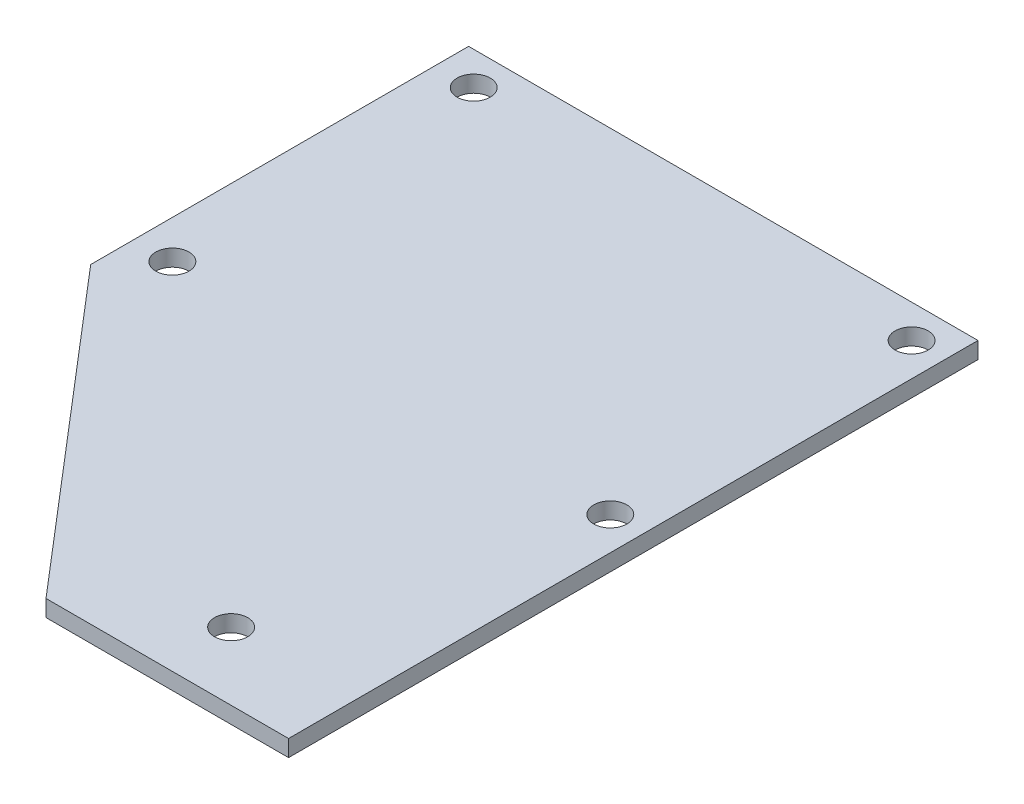
ISO-10303-21;
HEADER;
FILE_DESCRIPTION(('STEP AP214'),'2;1');
FILE_NAME('part.step','',(''),(''),'','','');
FILE_SCHEMA(('AUTOMOTIVE_DESIGN { 1 0 10303 214 1 1 1 1 }'));
ENDSEC;
DATA;
#1=APPLICATION_CONTEXT('core data for automotive mechanical design processes');
#2=APPLICATION_PROTOCOL_DEFINITION('international standard','automotive_design',2000,#1);
#3=PRODUCT_CONTEXT('',#1,'mechanical');
#4=PRODUCT('Part','Part','',(#3));
#5=PRODUCT_RELATED_PRODUCT_CATEGORY('part','',(#4));
#6=PRODUCT_DEFINITION_FORMATION('','',#4);
#7=PRODUCT_DEFINITION_CONTEXT('part definition',#1,'design');
#8=PRODUCT_DEFINITION('design','',#6,#7);
#9=PRODUCT_DEFINITION_SHAPE('','',#8);
#10=(LENGTH_UNIT() NAMED_UNIT(*) SI_UNIT(.MILLI.,.METRE.));
#11=(NAMED_UNIT(*) PLANE_ANGLE_UNIT() SI_UNIT($,.RADIAN.));
#12=(NAMED_UNIT(*) SI_UNIT($,.STERADIAN.) SOLID_ANGLE_UNIT());
#13=UNCERTAINTY_MEASURE_WITH_UNIT(LENGTH_MEASURE(1.E-05),#10,'distance_accuracy_value','');
#14=(GEOMETRIC_REPRESENTATION_CONTEXT(3) GLOBAL_UNCERTAINTY_ASSIGNED_CONTEXT((#13)) GLOBAL_UNIT_ASSIGNED_CONTEXT((#10,
#11,#12)) REPRESENTATION_CONTEXT('',''));
#15=CARTESIAN_POINT('',(0.,0.,0.));
#16=DIRECTION('',(0.,0.,1.));
#17=DIRECTION('',(1.,0.,0.));
#18=AXIS2_PLACEMENT_3D('',#15,#16,#17);
#19=CARTESIAN_POINT('',(0.,3.302,0.));
#20=DIRECTION('',(-1.,0.,0.));
#21=DIRECTION('',(0.,0.,1.));
#22=AXIS2_PLACEMENT_3D('',#19,#20,#21);
#23=PLANE('',#22);
#24=DIRECTION('',(0.,0.,-1.));
#25=VECTOR('',#24,1.);
#26=CARTESIAN_POINT('',(0.,0.,0.));
#27=LINE('',#26,#25);
#28=CARTESIAN_POINT('',(0.,0.,0.));
#29=VERTEX_POINT('',#28);
#30=CARTESIAN_POINT('',(0.,0.,-137.16));
#31=VERTEX_POINT('',#30);
#32=EDGE_CURVE('E120',#29,#31,#27,.T.);
#33=ORIENTED_EDGE('',*,*,#32,.T.);
#34=DIRECTION('',(0.,-1.,0.));
#35=VECTOR('',#34,1.);
#36=CARTESIAN_POINT('',(0.,3.302,-137.16));
#37=LINE('',#36,#35);
#38=CARTESIAN_POINT('',(0.,3.302,-137.16));
#39=VERTEX_POINT('',#38);
#40=EDGE_CURVE('E11',#39,#31,#37,.T.);
#41=ORIENTED_EDGE('',*,*,#40,.F.);
#42=DIRECTION('',(0.,0.,-1.));
#43=VECTOR('',#42,1.);
#44=CARTESIAN_POINT('',(0.,3.302,0.));
#45=LINE('',#44,#43);
#46=CARTESIAN_POINT('',(0.,3.302,0.));
#47=VERTEX_POINT('',#46);
#48=EDGE_CURVE('E133',#47,#39,#45,.T.);
#49=ORIENTED_EDGE('',*,*,#48,.F.);
#50=DIRECTION('',(0.,-1.,0.));
#51=VECTOR('',#50,1.);
#52=CARTESIAN_POINT('',(0.,3.302,0.));
#53=LINE('',#52,#51);
#54=EDGE_CURVE('E116',#47,#29,#53,.T.);
#55=ORIENTED_EDGE('',*,*,#54,.T.);
#56=EDGE_LOOP('',(#33,#41,#49,#55));
#57=FACE_BOUND('',#56,.T.);
#58=ADVANCED_FACE('F39',(#57),#23,.F.);
#59=CARTESIAN_POINT('',(0.,3.302,-137.16));
#60=DIRECTION('',(0.,0.,1.));
#61=DIRECTION('',(1.,0.,0.));
#62=AXIS2_PLACEMENT_3D('',#59,#60,#61);
#63=PLANE('',#62);
#64=DIRECTION('',(-1.,0.,0.));
#65=VECTOR('',#64,1.);
#66=CARTESIAN_POINT('',(0.,0.,-137.16));
#67=LINE('',#66,#65);
#68=CARTESIAN_POINT('',(-101.346,0.,-137.16));
#69=VERTEX_POINT('',#68);
#70=EDGE_CURVE('E124',#31,#69,#67,.T.);
#71=ORIENTED_EDGE('',*,*,#70,.T.);
#72=DIRECTION('',(0.,-1.,0.));
#73=VECTOR('',#72,1.);
#74=CARTESIAN_POINT('',(-101.346,3.302,-137.16));
#75=LINE('',#74,#73);
#76=CARTESIAN_POINT('',(-101.346,3.302,-137.16));
#77=VERTEX_POINT('',#76);
#78=EDGE_CURVE('E49',#77,#69,#75,.T.);
#79=ORIENTED_EDGE('',*,*,#78,.F.);
#80=DIRECTION('',(-1.,0.,0.));
#81=VECTOR('',#80,1.);
#82=CARTESIAN_POINT('',(0.,3.302,-137.16));
#83=LINE('',#82,#81);
#84=EDGE_CURVE('E92',#39,#77,#83,.T.);
#85=ORIENTED_EDGE('',*,*,#84,.F.);
#86=ORIENTED_EDGE('',*,*,#40,.T.);
#87=EDGE_LOOP('',(#71,#79,#85,#86));
#88=FACE_BOUND('',#87,.T.);
#89=ADVANCED_FACE('F177',(#88),#63,.F.);
#90=CARTESIAN_POINT('',(-101.346,3.302,-137.16));
#91=DIRECTION('',(1.,0.,0.));
#92=DIRECTION('',(0.,0.,-1.));
#93=AXIS2_PLACEMENT_3D('',#90,#91,#92);
#94=PLANE('',#93);
#95=DIRECTION('',(0.,0.,1.));
#96=VECTOR('',#95,1.);
#97=CARTESIAN_POINT('',(-101.346,0.,-137.16));
#98=LINE('',#97,#96);
#99=CARTESIAN_POINT('',(-101.346,0.,-61.976));
#100=VERTEX_POINT('',#99);
#101=EDGE_CURVE('E108',#69,#100,#98,.T.);
#102=ORIENTED_EDGE('',*,*,#101,.T.);
#103=DIRECTION('',(0.,-1.,0.));
#104=VECTOR('',#103,1.);
#105=CARTESIAN_POINT('',(-101.346,3.302,-61.976));
#106=LINE('',#105,#104);
#107=CARTESIAN_POINT('',(-101.346,3.302,-61.976));
#108=VERTEX_POINT('',#107);
#109=EDGE_CURVE('E105',#108,#100,#106,.T.);
#110=ORIENTED_EDGE('',*,*,#109,.F.);
#111=DIRECTION('',(0.,0.,1.));
#112=VECTOR('',#111,1.);
#113=CARTESIAN_POINT('',(-101.346,3.302,-137.16));
#114=LINE('',#113,#112);
#115=EDGE_CURVE('E96',#77,#108,#114,.T.);
#116=ORIENTED_EDGE('',*,*,#115,.F.);
#117=ORIENTED_EDGE('',*,*,#78,.T.);
#118=EDGE_LOOP('',(#102,#110,#116,#117));
#119=FACE_BOUND('',#118,.T.);
#120=ADVANCED_FACE('F106',(#119),#94,.F.);
#121=CARTESIAN_POINT('',(-48.26,3.302,0.));
#122=DIRECTION('',(0.759476272578049,0.,-0.650535003970542));
#123=DIRECTION('',(-0.650535003970542,0.,-0.759476272578049));
#124=AXIS2_PLACEMENT_3D('',#121,#122,#123);
#125=PLANE('',#124);
#126=DIRECTION('',(0.650535003970542,0.,0.759476272578049));
#127=VECTOR('',#126,1.);
#128=CARTESIAN_POINT('',(-48.26,0.,0.));
#129=LINE('',#128,#127);
#130=CARTESIAN_POINT('',(-48.26,0.,0.));
#131=VERTEX_POINT('',#130);
#132=EDGE_CURVE('E78',#100,#131,#129,.T.);
#133=ORIENTED_EDGE('',*,*,#132,.T.);
#134=DIRECTION('',(0.,-1.,0.));
#135=VECTOR('',#134,1.);
#136=CARTESIAN_POINT('',(-48.26,3.302,0.));
#137=LINE('',#136,#135);
#138=CARTESIAN_POINT('',(-48.26,3.302,0.));
#139=VERTEX_POINT('',#138);
#140=EDGE_CURVE('E110',#139,#131,#137,.T.);
#141=ORIENTED_EDGE('',*,*,#140,.F.);
#142=DIRECTION('',(0.650535003970542,0.,0.759476272578049));
#143=VECTOR('',#142,1.);
#144=CARTESIAN_POINT('',(-48.26,3.302,0.));
#145=LINE('',#144,#143);
#146=EDGE_CURVE('E100',#108,#139,#145,.T.);
#147=ORIENTED_EDGE('',*,*,#146,.F.);
#148=ORIENTED_EDGE('',*,*,#109,.T.);
#149=EDGE_LOOP('',(#133,#141,#147,#148));
#150=FACE_BOUND('',#149,.T.);
#151=ADVANCED_FACE('F112',(#150),#125,.F.);
#152=CARTESIAN_POINT('',(0.,3.302,0.));
#153=DIRECTION('',(0.,0.,-1.));
#154=DIRECTION('',(-1.,0.,0.));
#155=AXIS2_PLACEMENT_3D('',#152,#153,#154);
#156=PLANE('',#155);
#157=DIRECTION('',(1.,0.,0.));
#158=VECTOR('',#157,1.);
#159=CARTESIAN_POINT('',(0.,0.,0.));
#160=LINE('',#159,#158);
#161=EDGE_CURVE('E84',#131,#29,#160,.T.);
#162=ORIENTED_EDGE('',*,*,#161,.T.);
#163=ORIENTED_EDGE('',*,*,#54,.F.);
#164=DIRECTION('',(1.,0.,0.));
#165=VECTOR('',#164,1.);
#166=CARTESIAN_POINT('',(0.,3.302,0.));
#167=LINE('',#166,#165);
#168=EDGE_CURVE('E58',#139,#47,#167,.T.);
#169=ORIENTED_EDGE('',*,*,#168,.F.);
#170=ORIENTED_EDGE('',*,*,#140,.T.);
#171=EDGE_LOOP('',(#162,#163,#169,#170));
#172=FACE_BOUND('',#171,.T.);
#173=ADVANCED_FACE('F195',(#172),#156,.F.);
#174=CARTESIAN_POINT('',(0.,3.302,0.));
#175=DIRECTION('',(0.,1.,0.));
#176=DIRECTION('',(0.,0.,1.));
#177=AXIS2_PLACEMENT_3D('',#174,#175,#176);
#178=PLANE('',#177);
#179=CARTESIAN_POINT('',(-93.726,3.302,-130.556));
#180=DIRECTION('',(0.,1.,0.));
#181=DIRECTION('',(0.,0.,1.));
#182=AXIS2_PLACEMENT_3D('',#179,#180,#181);
#183=CIRCLE('',#182,3.302);
#184=CARTESIAN_POINT('',(-93.726,3.302,-127.254));
#185=VERTEX_POINT('',#184);
#186=EDGE_CURVE('E284',#185,#185,#183,.T.);
#187=ORIENTED_EDGE('',*,*,#186,.F.);
#188=EDGE_LOOP('',(#187));
#189=FACE_BOUND('',#188,.T.);
#190=CARTESIAN_POINT('',(-6.604,3.302,-130.556));
#191=DIRECTION('',(0.,1.,0.));
#192=DIRECTION('',(0.,0.,1.));
#193=AXIS2_PLACEMENT_3D('',#190,#191,#192);
#194=CIRCLE('',#193,3.302);
#195=CARTESIAN_POINT('',(-6.604,3.302,-127.254));
#196=VERTEX_POINT('',#195);
#197=EDGE_CURVE('E277',#196,#196,#194,.T.);
#198=ORIENTED_EDGE('',*,*,#197,.F.);
#199=EDGE_LOOP('',(#198));
#200=FACE_BOUND('',#199,.T.);
#201=CARTESIAN_POINT('',(-6.604,3.302,-70.612));
#202=DIRECTION('',(0.,1.,0.));
#203=DIRECTION('',(0.,0.,1.));
#204=AXIS2_PLACEMENT_3D('',#201,#202,#203);
#205=CIRCLE('',#204,3.302);
#206=CARTESIAN_POINT('',(-6.604,3.302,-67.31));
#207=VERTEX_POINT('',#206);
#208=EDGE_CURVE('E265',#207,#207,#205,.T.);
#209=ORIENTED_EDGE('',*,*,#208,.F.);
#210=EDGE_LOOP('',(#209));
#211=FACE_BOUND('',#210,.T.);
#212=CARTESIAN_POINT('',(-24.892,3.302,-13.462));
#213=DIRECTION('',(0.,1.,0.));
#214=DIRECTION('',(0.,0.,1.));
#215=AXIS2_PLACEMENT_3D('',#212,#213,#214);
#216=CIRCLE('',#215,3.302);
#217=CARTESIAN_POINT('',(-24.892,3.302,-10.16));
#218=VERTEX_POINT('',#217);
#219=EDGE_CURVE('E276',#218,#218,#216,.T.);
#220=ORIENTED_EDGE('',*,*,#219,.F.);
#221=EDGE_LOOP('',(#220));
#222=FACE_BOUND('',#221,.T.);
#223=CARTESIAN_POINT('',(-93.726,3.302,-70.612));
#224=DIRECTION('',(0.,1.,0.));
#225=DIRECTION('',(0.,0.,1.));
#226=AXIS2_PLACEMENT_3D('',#223,#224,#225);
#227=CIRCLE('',#226,3.302);
#228=CARTESIAN_POINT('',(-93.726,3.302,-67.31));
#229=VERTEX_POINT('',#228);
#230=EDGE_CURVE('E145',#229,#229,#227,.T.);
#231=ORIENTED_EDGE('',*,*,#230,.F.);
#232=EDGE_LOOP('',(#231));
#233=FACE_BOUND('',#232,.T.);
#234=ORIENTED_EDGE('',*,*,#48,.T.);
#235=ORIENTED_EDGE('',*,*,#84,.T.);
#236=ORIENTED_EDGE('',*,*,#115,.T.);
#237=ORIENTED_EDGE('',*,*,#146,.T.);
#238=ORIENTED_EDGE('',*,*,#168,.T.);
#239=EDGE_LOOP('',(#234,#235,#236,#237,#238));
#240=FACE_BOUND('',#239,.T.);
#241=ADVANCED_FACE('F98',(#189,#200,#211,#222,#233,#240),#178,.T.);
#242=CARTESIAN_POINT('',(0.,0.,0.));
#243=DIRECTION('',(0.,1.,0.));
#244=DIRECTION('',(0.,0.,1.));
#245=AXIS2_PLACEMENT_3D('',#242,#243,#244);
#246=PLANE('',#245);
#247=CARTESIAN_POINT('',(-93.726,0.,-130.556));
#248=DIRECTION('',(0.,1.,0.));
#249=DIRECTION('',(0.,0.,1.));
#250=AXIS2_PLACEMENT_3D('',#247,#248,#249);
#251=CIRCLE('',#250,3.302);
#252=CARTESIAN_POINT('',(-93.726,0.,-127.254));
#253=VERTEX_POINT('',#252);
#254=EDGE_CURVE('E42',#253,#253,#251,.T.);
#255=ORIENTED_EDGE('',*,*,#254,.T.);
#256=EDGE_LOOP('',(#255));
#257=FACE_BOUND('',#256,.T.);
#258=CARTESIAN_POINT('',(-6.604,0.,-130.556));
#259=DIRECTION('',(0.,1.,0.));
#260=DIRECTION('',(0.,0.,1.));
#261=AXIS2_PLACEMENT_3D('',#258,#259,#260);
#262=CIRCLE('',#261,3.302);
#263=CARTESIAN_POINT('',(-6.604,0.,-127.254));
#264=VERTEX_POINT('',#263);
#265=EDGE_CURVE('E152',#264,#264,#262,.T.);
#266=ORIENTED_EDGE('',*,*,#265,.T.);
#267=EDGE_LOOP('',(#266));
#268=FACE_BOUND('',#267,.T.);
#269=CARTESIAN_POINT('',(-6.604,0.,-70.612));
#270=DIRECTION('',(0.,1.,0.));
#271=DIRECTION('',(0.,0.,1.));
#272=AXIS2_PLACEMENT_3D('',#269,#270,#271);
#273=CIRCLE('',#272,3.302);
#274=CARTESIAN_POINT('',(-6.604,0.,-67.31));
#275=VERTEX_POINT('',#274);
#276=EDGE_CURVE('E149',#275,#275,#273,.T.);
#277=ORIENTED_EDGE('',*,*,#276,.T.);
#278=EDGE_LOOP('',(#277));
#279=FACE_BOUND('',#278,.T.);
#280=CARTESIAN_POINT('',(-24.892,0.,-13.462));
#281=DIRECTION('',(0.,1.,0.));
#282=DIRECTION('',(0.,0.,1.));
#283=AXIS2_PLACEMENT_3D('',#280,#281,#282);
#284=CIRCLE('',#283,3.302);
#285=CARTESIAN_POINT('',(-24.892,0.,-10.16));
#286=VERTEX_POINT('',#285);
#287=EDGE_CURVE('E144',#286,#286,#284,.T.);
#288=ORIENTED_EDGE('',*,*,#287,.T.);
#289=EDGE_LOOP('',(#288));
#290=FACE_BOUND('',#289,.T.);
#291=CARTESIAN_POINT('',(-93.726,0.,-70.612));
#292=DIRECTION('',(0.,1.,0.));
#293=DIRECTION('',(0.,0.,1.));
#294=AXIS2_PLACEMENT_3D('',#291,#292,#293);
#295=CIRCLE('',#294,3.302);
#296=CARTESIAN_POINT('',(-93.726,0.,-67.31));
#297=VERTEX_POINT('',#296);
#298=EDGE_CURVE('E140',#297,#297,#295,.T.);
#299=ORIENTED_EDGE('',*,*,#298,.T.);
#300=EDGE_LOOP('',(#299));
#301=FACE_BOUND('',#300,.T.);
#302=ORIENTED_EDGE('',*,*,#32,.F.);
#303=ORIENTED_EDGE('',*,*,#161,.F.);
#304=ORIENTED_EDGE('',*,*,#132,.F.);
#305=ORIENTED_EDGE('',*,*,#101,.F.);
#306=ORIENTED_EDGE('',*,*,#70,.F.);
#307=EDGE_LOOP('',(#302,#303,#304,#305,#306));
#308=FACE_BOUND('',#307,.T.);
#309=ADVANCED_FACE('F161',(#257,#268,#279,#290,#301,#308),#246,.F.);
#310=CARTESIAN_POINT('',(-93.726,-20.066,-70.612));
#311=DIRECTION('',(0.,1.,0.));
#312=DIRECTION('',(0.,0.,1.));
#313=AXIS2_PLACEMENT_3D('',#310,#311,#312);
#314=CYLINDRICAL_SURFACE('',#313,3.302);
#315=CARTESIAN_POINT('',(-93.726,3.302,-67.31));
#316=CARTESIAN_POINT('',(-93.726,3.26760416666667,-67.31));
#317=CARTESIAN_POINT('',(-93.726,3.23320833333334,-67.31));
#318=CARTESIAN_POINT('',(-93.726,3.16441666666667,-67.31));
#319=CARTESIAN_POINT('',(-93.726,3.13002083333333,-67.31));
#320=CARTESIAN_POINT('',(-93.726,3.06122916666667,-67.31));
#321=CARTESIAN_POINT('',(-93.726,3.02683333333334,-67.31));
#322=CARTESIAN_POINT('',(-93.726,2.95804166666667,-67.31));
#323=CARTESIAN_POINT('',(-93.726,2.92364583333334,-67.31));
#324=CARTESIAN_POINT('',(-93.726,2.85485416666667,-67.31));
#325=CARTESIAN_POINT('',(-93.726,2.82045833333334,-67.31));
#326=CARTESIAN_POINT('',(-93.726,2.75166666666667,-67.31));
#327=CARTESIAN_POINT('',(-93.726,2.71727083333333,-67.31));
#328=CARTESIAN_POINT('',(-93.726,2.64847916666667,-67.31));
#329=CARTESIAN_POINT('',(-93.726,2.61408333333333,-67.31));
#330=CARTESIAN_POINT('',(-93.726,2.54529166666667,-67.31));
#331=CARTESIAN_POINT('',(-93.726,2.51089583333334,-67.31));
#332=CARTESIAN_POINT('',(-93.726,2.44210416666667,-67.31));
#333=CARTESIAN_POINT('',(-93.726,2.40770833333334,-67.31));
#334=CARTESIAN_POINT('',(-93.726,2.33891666666667,-67.31));
#335=CARTESIAN_POINT('',(-93.726,2.30452083333333,-67.31));
#336=CARTESIAN_POINT('',(-93.726,2.23572916666667,-67.31));
#337=CARTESIAN_POINT('',(-93.726,2.20133333333333,-67.31));
#338=CARTESIAN_POINT('',(-93.726,2.13254166666667,-67.31));
#339=CARTESIAN_POINT('',(-93.726,2.09814583333333,-67.31));
#340=CARTESIAN_POINT('',(-93.726,2.02935416666667,-67.31));
#341=CARTESIAN_POINT('',(-93.726,1.99495833333333,-67.31));
#342=CARTESIAN_POINT('',(-93.726,1.92616666666667,-67.31));
#343=CARTESIAN_POINT('',(-93.726,1.89177083333333,-67.31));
#344=CARTESIAN_POINT('',(-93.726,1.82297916666667,-67.31));
#345=CARTESIAN_POINT('',(-93.726,1.78858333333333,-67.31));
#346=CARTESIAN_POINT('',(-93.726,1.71979166666667,-67.31));
#347=CARTESIAN_POINT('',(-93.726,1.68539583333333,-67.31));
#348=CARTESIAN_POINT('',(-93.726,1.61660416666667,-67.31));
#349=CARTESIAN_POINT('',(-93.726,1.58220833333333,-67.31));
#350=CARTESIAN_POINT('',(-93.726,1.51341666666667,-67.31));
#351=CARTESIAN_POINT('',(-93.726,1.47902083333333,-67.31));
#352=CARTESIAN_POINT('',(-93.726,1.41022916666666,-67.31));
#353=CARTESIAN_POINT('',(-93.726,1.37583333333333,-67.31));
#354=CARTESIAN_POINT('',(-93.726,1.30704166666666,-67.31));
#355=CARTESIAN_POINT('',(-93.726,1.27264583333333,-67.31));
#356=CARTESIAN_POINT('',(-93.726,1.20385416666667,-67.31));
#357=CARTESIAN_POINT('',(-93.726,1.16945833333333,-67.31));
#358=CARTESIAN_POINT('',(-93.726,1.10066666666667,-67.31));
#359=CARTESIAN_POINT('',(-93.726,1.06627083333333,-67.31));
#360=CARTESIAN_POINT('',(-93.726,0.997479166666664,-67.31));
#361=CARTESIAN_POINT('',(-93.726,0.963083333333331,-67.31));
#362=CARTESIAN_POINT('',(-93.726,0.894291666666664,-67.31));
#363=CARTESIAN_POINT('',(-93.726,0.85989583333333,-67.31));
#364=CARTESIAN_POINT('',(-93.726,0.791104166666664,-67.31));
#365=CARTESIAN_POINT('',(-93.726,0.756708333333331,-67.31));
#366=CARTESIAN_POINT('',(-93.726,0.687916666666665,-67.31));
#367=CARTESIAN_POINT('',(-93.726,0.653520833333332,-67.31));
#368=CARTESIAN_POINT('',(-93.726,0.584729166666665,-67.31));
#369=CARTESIAN_POINT('',(-93.726,0.550333333333331,-67.31));
#370=CARTESIAN_POINT('',(-93.726,0.481541666666664,-67.31));
#371=CARTESIAN_POINT('',(-93.726,0.44714583333333,-67.31));
#372=CARTESIAN_POINT('',(-93.726,0.378354166666663,-67.31));
#373=CARTESIAN_POINT('',(-93.726,0.343958333333329,-67.31));
#374=CARTESIAN_POINT('',(-93.726,0.275166666666663,-67.31));
#375=CARTESIAN_POINT('',(-93.726,0.240770833333331,-67.31));
#376=CARTESIAN_POINT('',(-93.726,0.171979166666665,-67.31));
#377=CARTESIAN_POINT('',(-93.726,0.137583333333331,-67.31));
#378=CARTESIAN_POINT('',(-93.726,0.0687916666666638,-67.31));
#379=CARTESIAN_POINT('',(-93.726,0.0343958333333301,-67.31));
#380=CARTESIAN_POINT('',(-93.726,0.,-67.31));
#381=B_SPLINE_CURVE_WITH_KNOTS('',3,(#315,#316,#317,#318,#319,#320,#321,#322,#323,#324,#325,
#326,#327,#328,#329,#330,#331,#332,#333,#334,#335,#336,#337,#338,#339,#340,#341,#342,#343,#344,
#345,#346,#347,#348,#349,#350,#351,#352,#353,#354,#355,#356,#357,#358,#359,#360,#361,#362,#363,
#364,#365,#366,#367,#368,#369,#370,#371,#372,#373,#374,#375,#376,#377,#378,#379,#380),
.UNSPECIFIED.,.F.,.F.,(4,2,2,2,2,2,2,2,2,2,2,2,2,2,2,2,2,2,2,2,2,2,2,2,2,2,2,2,2,2,2,2,4),(0.,
0.103187500000001,0.206375000000002,0.309562499999999,0.41275,0.515937500000001,
0.619125000000002,0.722312500000002,0.8255,0.928687500000001,1.031875,1.1350625,1.23825,
1.3414375,1.444625,1.5478125,1.651,1.7541875,1.857375,1.96056250000001,2.06375,2.1669375,
2.270125,2.37331250000001,2.47650000000001,2.5796875,2.682875,2.78606250000001,2.88925000000001,
2.99243750000001,3.095625,3.19881250000001,3.30200000000001),.UNSPECIFIED.);
#382=EDGE_CURVE('BSEAM187',#229,#297,#381,.T.);
#383=ORIENTED_EDGE('',*,*,#230,.T.);
#384=ORIENTED_EDGE('',*,*,#298,.F.);
#385=ORIENTED_EDGE('',*,*,#382,.T.);
#386=ORIENTED_EDGE('',*,*,#382,.F.);
#387=EDGE_LOOP('',(#383,#385,#384,#386));
#388=FACE_BOUND('',#387,.T.);
#389=ADVANCED_FACE('F187',(#388),#314,.F.);
#390=CARTESIAN_POINT('',(-24.892,-20.066,-13.462));
#391=DIRECTION('',(0.,1.,0.));
#392=DIRECTION('',(0.,0.,1.));
#393=AXIS2_PLACEMENT_3D('',#390,#391,#392);
#394=CYLINDRICAL_SURFACE('',#393,3.302);
#395=CARTESIAN_POINT('',(-24.892,3.302,-10.16));
#396=CARTESIAN_POINT('',(-24.892,3.26760416666667,-10.16));
#397=CARTESIAN_POINT('',(-24.892,3.23320833333334,-10.16));
#398=CARTESIAN_POINT('',(-24.892,3.16441666666667,-10.16));
#399=CARTESIAN_POINT('',(-24.892,3.13002083333333,-10.16));
#400=CARTESIAN_POINT('',(-24.892,3.06122916666667,-10.16));
#401=CARTESIAN_POINT('',(-24.892,3.02683333333334,-10.16));
#402=CARTESIAN_POINT('',(-24.892,2.95804166666667,-10.16));
#403=CARTESIAN_POINT('',(-24.892,2.92364583333334,-10.16));
#404=CARTESIAN_POINT('',(-24.892,2.85485416666667,-10.16));
#405=CARTESIAN_POINT('',(-24.892,2.82045833333334,-10.16));
#406=CARTESIAN_POINT('',(-24.892,2.75166666666667,-10.16));
#407=CARTESIAN_POINT('',(-24.892,2.71727083333333,-10.16));
#408=CARTESIAN_POINT('',(-24.892,2.64847916666667,-10.16));
#409=CARTESIAN_POINT('',(-24.892,2.61408333333333,-10.16));
#410=CARTESIAN_POINT('',(-24.892,2.54529166666667,-10.16));
#411=CARTESIAN_POINT('',(-24.892,2.51089583333334,-10.16));
#412=CARTESIAN_POINT('',(-24.892,2.44210416666667,-10.16));
#413=CARTESIAN_POINT('',(-24.892,2.40770833333334,-10.16));
#414=CARTESIAN_POINT('',(-24.892,2.33891666666667,-10.16));
#415=CARTESIAN_POINT('',(-24.892,2.30452083333333,-10.16));
#416=CARTESIAN_POINT('',(-24.892,2.23572916666667,-10.16));
#417=CARTESIAN_POINT('',(-24.892,2.20133333333333,-10.16));
#418=CARTESIAN_POINT('',(-24.892,2.13254166666667,-10.16));
#419=CARTESIAN_POINT('',(-24.892,2.09814583333333,-10.16));
#420=CARTESIAN_POINT('',(-24.892,2.02935416666667,-10.16));
#421=CARTESIAN_POINT('',(-24.892,1.99495833333333,-10.16));
#422=CARTESIAN_POINT('',(-24.892,1.92616666666667,-10.16));
#423=CARTESIAN_POINT('',(-24.892,1.89177083333333,-10.16));
#424=CARTESIAN_POINT('',(-24.892,1.82297916666667,-10.16));
#425=CARTESIAN_POINT('',(-24.892,1.78858333333333,-10.16));
#426=CARTESIAN_POINT('',(-24.892,1.71979166666667,-10.16));
#427=CARTESIAN_POINT('',(-24.892,1.68539583333333,-10.16));
#428=CARTESIAN_POINT('',(-24.892,1.61660416666667,-10.16));
#429=CARTESIAN_POINT('',(-24.892,1.58220833333333,-10.16));
#430=CARTESIAN_POINT('',(-24.892,1.51341666666667,-10.16));
#431=CARTESIAN_POINT('',(-24.892,1.47902083333333,-10.16));
#432=CARTESIAN_POINT('',(-24.892,1.41022916666666,-10.16));
#433=CARTESIAN_POINT('',(-24.892,1.37583333333333,-10.16));
#434=CARTESIAN_POINT('',(-24.892,1.30704166666666,-10.16));
#435=CARTESIAN_POINT('',(-24.892,1.27264583333333,-10.16));
#436=CARTESIAN_POINT('',(-24.892,1.20385416666667,-10.16));
#437=CARTESIAN_POINT('',(-24.892,1.16945833333333,-10.16));
#438=CARTESIAN_POINT('',(-24.892,1.10066666666667,-10.16));
#439=CARTESIAN_POINT('',(-24.892,1.06627083333333,-10.16));
#440=CARTESIAN_POINT('',(-24.892,0.997479166666664,-10.16));
#441=CARTESIAN_POINT('',(-24.892,0.963083333333331,-10.16));
#442=CARTESIAN_POINT('',(-24.892,0.894291666666664,-10.16));
#443=CARTESIAN_POINT('',(-24.892,0.85989583333333,-10.16));
#444=CARTESIAN_POINT('',(-24.892,0.791104166666664,-10.16));
#445=CARTESIAN_POINT('',(-24.892,0.756708333333331,-10.16));
#446=CARTESIAN_POINT('',(-24.892,0.687916666666665,-10.16));
#447=CARTESIAN_POINT('',(-24.892,0.653520833333332,-10.16));
#448=CARTESIAN_POINT('',(-24.892,0.584729166666665,-10.16));
#449=CARTESIAN_POINT('',(-24.892,0.550333333333331,-10.16));
#450=CARTESIAN_POINT('',(-24.892,0.481541666666664,-10.16));
#451=CARTESIAN_POINT('',(-24.892,0.44714583333333,-10.16));
#452=CARTESIAN_POINT('',(-24.892,0.378354166666663,-10.16));
#453=CARTESIAN_POINT('',(-24.892,0.343958333333329,-10.16));
#454=CARTESIAN_POINT('',(-24.892,0.275166666666663,-10.16));
#455=CARTESIAN_POINT('',(-24.892,0.240770833333331,-10.16));
#456=CARTESIAN_POINT('',(-24.892,0.171979166666665,-10.16));
#457=CARTESIAN_POINT('',(-24.892,0.137583333333331,-10.16));
#458=CARTESIAN_POINT('',(-24.892,0.0687916666666638,-10.16));
#459=CARTESIAN_POINT('',(-24.892,0.0343958333333301,-10.16));
#460=CARTESIAN_POINT('',(-24.892,0.,-10.16));
#461=B_SPLINE_CURVE_WITH_KNOTS('',3,(#395,#396,#397,#398,#399,#400,#401,#402,#403,#404,#405,
#406,#407,#408,#409,#410,#411,#412,#413,#414,#415,#416,#417,#418,#419,#420,#421,#422,#423,#424,
#425,#426,#427,#428,#429,#430,#431,#432,#433,#434,#435,#436,#437,#438,#439,#440,#441,#442,#443,
#444,#445,#446,#447,#448,#449,#450,#451,#452,#453,#454,#455,#456,#457,#458,#459,#460),
.UNSPECIFIED.,.F.,.F.,(4,2,2,2,2,2,2,2,2,2,2,2,2,2,2,2,2,2,2,2,2,2,2,2,2,2,2,2,2,2,2,2,4),(0.,
0.103187500000001,0.206375000000002,0.309562499999999,0.41275,0.515937500000001,
0.619125000000002,0.722312500000002,0.8255,0.928687500000001,1.031875,1.1350625,1.23825,
1.3414375,1.444625,1.5478125,1.651,1.7541875,1.857375,1.96056250000001,2.06375,2.1669375,
2.270125,2.37331250000001,2.47650000000001,2.5796875,2.682875,2.78606250000001,2.88925000000001,
2.99243750000001,3.095625,3.19881250000001,3.30200000000001),.UNSPECIFIED.);
#462=EDGE_CURVE('BSEAM193',#218,#286,#461,.T.);
#463=ORIENTED_EDGE('',*,*,#219,.T.);
#464=ORIENTED_EDGE('',*,*,#287,.F.);
#465=ORIENTED_EDGE('',*,*,#462,.T.);
#466=ORIENTED_EDGE('',*,*,#462,.F.);
#467=EDGE_LOOP('',(#463,#465,#464,#466));
#468=FACE_BOUND('',#467,.T.);
#469=ADVANCED_FACE('F193',(#468),#394,.F.);
#470=CARTESIAN_POINT('',(-6.604,-20.066,-70.612));
#471=DIRECTION('',(0.,1.,0.));
#472=DIRECTION('',(0.,0.,1.));
#473=AXIS2_PLACEMENT_3D('',#470,#471,#472);
#474=CYLINDRICAL_SURFACE('',#473,3.302);
#475=CARTESIAN_POINT('',(-6.604,3.302,-67.31));
#476=CARTESIAN_POINT('',(-6.604,3.26760416666667,-67.31));
#477=CARTESIAN_POINT('',(-6.604,3.23320833333334,-67.31));
#478=CARTESIAN_POINT('',(-6.604,3.16441666666667,-67.31));
#479=CARTESIAN_POINT('',(-6.604,3.13002083333333,-67.31));
#480=CARTESIAN_POINT('',(-6.604,3.06122916666667,-67.31));
#481=CARTESIAN_POINT('',(-6.604,3.02683333333334,-67.31));
#482=CARTESIAN_POINT('',(-6.604,2.95804166666667,-67.31));
#483=CARTESIAN_POINT('',(-6.604,2.92364583333334,-67.31));
#484=CARTESIAN_POINT('',(-6.604,2.85485416666667,-67.31));
#485=CARTESIAN_POINT('',(-6.604,2.82045833333334,-67.31));
#486=CARTESIAN_POINT('',(-6.604,2.75166666666667,-67.31));
#487=CARTESIAN_POINT('',(-6.604,2.71727083333333,-67.31));
#488=CARTESIAN_POINT('',(-6.604,2.64847916666667,-67.31));
#489=CARTESIAN_POINT('',(-6.604,2.61408333333333,-67.31));
#490=CARTESIAN_POINT('',(-6.604,2.54529166666667,-67.31));
#491=CARTESIAN_POINT('',(-6.604,2.51089583333334,-67.31));
#492=CARTESIAN_POINT('',(-6.604,2.44210416666667,-67.31));
#493=CARTESIAN_POINT('',(-6.604,2.40770833333334,-67.31));
#494=CARTESIAN_POINT('',(-6.604,2.33891666666667,-67.31));
#495=CARTESIAN_POINT('',(-6.604,2.30452083333333,-67.31));
#496=CARTESIAN_POINT('',(-6.604,2.23572916666667,-67.31));
#497=CARTESIAN_POINT('',(-6.604,2.20133333333333,-67.31));
#498=CARTESIAN_POINT('',(-6.604,2.13254166666667,-67.31));
#499=CARTESIAN_POINT('',(-6.604,2.09814583333333,-67.31));
#500=CARTESIAN_POINT('',(-6.604,2.02935416666667,-67.31));
#501=CARTESIAN_POINT('',(-6.604,1.99495833333333,-67.31));
#502=CARTESIAN_POINT('',(-6.604,1.92616666666667,-67.31));
#503=CARTESIAN_POINT('',(-6.604,1.89177083333333,-67.31));
#504=CARTESIAN_POINT('',(-6.604,1.82297916666667,-67.31));
#505=CARTESIAN_POINT('',(-6.604,1.78858333333333,-67.31));
#506=CARTESIAN_POINT('',(-6.604,1.71979166666667,-67.31));
#507=CARTESIAN_POINT('',(-6.604,1.68539583333333,-67.31));
#508=CARTESIAN_POINT('',(-6.604,1.61660416666667,-67.31));
#509=CARTESIAN_POINT('',(-6.604,1.58220833333333,-67.31));
#510=CARTESIAN_POINT('',(-6.604,1.51341666666667,-67.31));
#511=CARTESIAN_POINT('',(-6.604,1.47902083333333,-67.31));
#512=CARTESIAN_POINT('',(-6.604,1.41022916666666,-67.31));
#513=CARTESIAN_POINT('',(-6.604,1.37583333333333,-67.31));
#514=CARTESIAN_POINT('',(-6.604,1.30704166666666,-67.31));
#515=CARTESIAN_POINT('',(-6.604,1.27264583333333,-67.31));
#516=CARTESIAN_POINT('',(-6.604,1.20385416666667,-67.31));
#517=CARTESIAN_POINT('',(-6.604,1.16945833333333,-67.31));
#518=CARTESIAN_POINT('',(-6.604,1.10066666666667,-67.31));
#519=CARTESIAN_POINT('',(-6.604,1.06627083333333,-67.31));
#520=CARTESIAN_POINT('',(-6.604,0.997479166666664,-67.31));
#521=CARTESIAN_POINT('',(-6.604,0.963083333333331,-67.31));
#522=CARTESIAN_POINT('',(-6.604,0.894291666666664,-67.31));
#523=CARTESIAN_POINT('',(-6.604,0.85989583333333,-67.31));
#524=CARTESIAN_POINT('',(-6.604,0.791104166666664,-67.31));
#525=CARTESIAN_POINT('',(-6.604,0.756708333333331,-67.31));
#526=CARTESIAN_POINT('',(-6.604,0.687916666666665,-67.31));
#527=CARTESIAN_POINT('',(-6.604,0.653520833333332,-67.31));
#528=CARTESIAN_POINT('',(-6.604,0.584729166666665,-67.31));
#529=CARTESIAN_POINT('',(-6.604,0.550333333333331,-67.31));
#530=CARTESIAN_POINT('',(-6.604,0.481541666666664,-67.31));
#531=CARTESIAN_POINT('',(-6.604,0.44714583333333,-67.31));
#532=CARTESIAN_POINT('',(-6.604,0.378354166666663,-67.31));
#533=CARTESIAN_POINT('',(-6.604,0.343958333333329,-67.31));
#534=CARTESIAN_POINT('',(-6.604,0.275166666666663,-67.31));
#535=CARTESIAN_POINT('',(-6.604,0.240770833333331,-67.31));
#536=CARTESIAN_POINT('',(-6.604,0.171979166666665,-67.31));
#537=CARTESIAN_POINT('',(-6.604,0.137583333333331,-67.31));
#538=CARTESIAN_POINT('',(-6.604,0.0687916666666638,-67.31));
#539=CARTESIAN_POINT('',(-6.604,0.0343958333333301,-67.31));
#540=CARTESIAN_POINT('',(-6.604,0.,-67.31));
#541=B_SPLINE_CURVE_WITH_KNOTS('',3,(#475,#476,#477,#478,#479,#480,#481,#482,#483,#484,#485,
#486,#487,#488,#489,#490,#491,#492,#493,#494,#495,#496,#497,#498,#499,#500,#501,#502,#503,#504,
#505,#506,#507,#508,#509,#510,#511,#512,#513,#514,#515,#516,#517,#518,#519,#520,#521,#522,#523,
#524,#525,#526,#527,#528,#529,#530,#531,#532,#533,#534,#535,#536,#537,#538,#539,#540),
.UNSPECIFIED.,.F.,.F.,(4,2,2,2,2,2,2,2,2,2,2,2,2,2,2,2,2,2,2,2,2,2,2,2,2,2,2,2,2,2,2,2,4),(0.,
0.103187500000001,0.206375000000002,0.309562499999999,0.41275,0.515937500000001,
0.619125000000002,0.722312500000002,0.8255,0.928687500000001,1.031875,1.1350625,1.23825,
1.3414375,1.444625,1.5478125,1.651,1.7541875,1.857375,1.96056250000001,2.06375,2.1669375,
2.270125,2.37331250000001,2.47650000000001,2.5796875,2.682875,2.78606250000001,2.88925000000001,
2.99243750000001,3.095625,3.19881250000001,3.30200000000001),.UNSPECIFIED.);
#542=EDGE_CURVE('BSEAM171',#207,#275,#541,.T.);
#543=ORIENTED_EDGE('',*,*,#208,.T.);
#544=ORIENTED_EDGE('',*,*,#276,.F.);
#545=ORIENTED_EDGE('',*,*,#542,.T.);
#546=ORIENTED_EDGE('',*,*,#542,.F.);
#547=EDGE_LOOP('',(#543,#545,#544,#546));
#548=FACE_BOUND('',#547,.T.);
#549=ADVANCED_FACE('F171',(#548),#474,.F.);
#550=CARTESIAN_POINT('',(-6.604,-20.066,-130.556));
#551=DIRECTION('',(0.,1.,0.));
#552=DIRECTION('',(0.,0.,1.));
#553=AXIS2_PLACEMENT_3D('',#550,#551,#552);
#554=CYLINDRICAL_SURFACE('',#553,3.302);
#555=CARTESIAN_POINT('',(-6.604,3.302,-127.254));
#556=CARTESIAN_POINT('',(-6.604,3.26760416666667,-127.254));
#557=CARTESIAN_POINT('',(-6.604,3.23320833333334,-127.254));
#558=CARTESIAN_POINT('',(-6.604,3.16441666666667,-127.254));
#559=CARTESIAN_POINT('',(-6.604,3.13002083333333,-127.254));
#560=CARTESIAN_POINT('',(-6.604,3.06122916666667,-127.254));
#561=CARTESIAN_POINT('',(-6.604,3.02683333333334,-127.254));
#562=CARTESIAN_POINT('',(-6.604,2.95804166666667,-127.254));
#563=CARTESIAN_POINT('',(-6.604,2.92364583333334,-127.254));
#564=CARTESIAN_POINT('',(-6.604,2.85485416666667,-127.254));
#565=CARTESIAN_POINT('',(-6.604,2.82045833333334,-127.254));
#566=CARTESIAN_POINT('',(-6.604,2.75166666666667,-127.254));
#567=CARTESIAN_POINT('',(-6.604,2.71727083333333,-127.254));
#568=CARTESIAN_POINT('',(-6.604,2.64847916666667,-127.254));
#569=CARTESIAN_POINT('',(-6.604,2.61408333333333,-127.254));
#570=CARTESIAN_POINT('',(-6.604,2.54529166666667,-127.254));
#571=CARTESIAN_POINT('',(-6.604,2.51089583333334,-127.254));
#572=CARTESIAN_POINT('',(-6.604,2.44210416666667,-127.254));
#573=CARTESIAN_POINT('',(-6.604,2.40770833333334,-127.254));
#574=CARTESIAN_POINT('',(-6.604,2.33891666666667,-127.254));
#575=CARTESIAN_POINT('',(-6.604,2.30452083333333,-127.254));
#576=CARTESIAN_POINT('',(-6.604,2.23572916666667,-127.254));
#577=CARTESIAN_POINT('',(-6.604,2.20133333333333,-127.254));
#578=CARTESIAN_POINT('',(-6.604,2.13254166666667,-127.254));
#579=CARTESIAN_POINT('',(-6.604,2.09814583333333,-127.254));
#580=CARTESIAN_POINT('',(-6.604,2.02935416666667,-127.254));
#581=CARTESIAN_POINT('',(-6.604,1.99495833333333,-127.254));
#582=CARTESIAN_POINT('',(-6.604,1.92616666666667,-127.254));
#583=CARTESIAN_POINT('',(-6.604,1.89177083333333,-127.254));
#584=CARTESIAN_POINT('',(-6.604,1.82297916666667,-127.254));
#585=CARTESIAN_POINT('',(-6.604,1.78858333333333,-127.254));
#586=CARTESIAN_POINT('',(-6.604,1.71979166666667,-127.254));
#587=CARTESIAN_POINT('',(-6.604,1.68539583333333,-127.254));
#588=CARTESIAN_POINT('',(-6.604,1.61660416666667,-127.254));
#589=CARTESIAN_POINT('',(-6.604,1.58220833333333,-127.254));
#590=CARTESIAN_POINT('',(-6.604,1.51341666666667,-127.254));
#591=CARTESIAN_POINT('',(-6.604,1.47902083333333,-127.254));
#592=CARTESIAN_POINT('',(-6.604,1.41022916666666,-127.254));
#593=CARTESIAN_POINT('',(-6.604,1.37583333333333,-127.254));
#594=CARTESIAN_POINT('',(-6.604,1.30704166666666,-127.254));
#595=CARTESIAN_POINT('',(-6.604,1.27264583333333,-127.254));
#596=CARTESIAN_POINT('',(-6.604,1.20385416666667,-127.254));
#597=CARTESIAN_POINT('',(-6.604,1.16945833333333,-127.254));
#598=CARTESIAN_POINT('',(-6.604,1.10066666666667,-127.254));
#599=CARTESIAN_POINT('',(-6.604,1.06627083333333,-127.254));
#600=CARTESIAN_POINT('',(-6.604,0.997479166666664,-127.254));
#601=CARTESIAN_POINT('',(-6.604,0.963083333333331,-127.254));
#602=CARTESIAN_POINT('',(-6.604,0.894291666666664,-127.254));
#603=CARTESIAN_POINT('',(-6.604,0.85989583333333,-127.254));
#604=CARTESIAN_POINT('',(-6.604,0.791104166666664,-127.254));
#605=CARTESIAN_POINT('',(-6.604,0.756708333333331,-127.254));
#606=CARTESIAN_POINT('',(-6.604,0.687916666666665,-127.254));
#607=CARTESIAN_POINT('',(-6.604,0.653520833333332,-127.254));
#608=CARTESIAN_POINT('',(-6.604,0.584729166666665,-127.254));
#609=CARTESIAN_POINT('',(-6.604,0.550333333333331,-127.254));
#610=CARTESIAN_POINT('',(-6.604,0.481541666666664,-127.254));
#611=CARTESIAN_POINT('',(-6.604,0.44714583333333,-127.254));
#612=CARTESIAN_POINT('',(-6.604,0.378354166666663,-127.254));
#613=CARTESIAN_POINT('',(-6.604,0.343958333333329,-127.254));
#614=CARTESIAN_POINT('',(-6.604,0.275166666666663,-127.254));
#615=CARTESIAN_POINT('',(-6.604,0.240770833333331,-127.254));
#616=CARTESIAN_POINT('',(-6.604,0.171979166666665,-127.254));
#617=CARTESIAN_POINT('',(-6.604,0.137583333333331,-127.254));
#618=CARTESIAN_POINT('',(-6.604,0.0687916666666638,-127.254));
#619=CARTESIAN_POINT('',(-6.604,0.0343958333333301,-127.254));
#620=CARTESIAN_POINT('',(-6.604,0.,-127.254));
#621=B_SPLINE_CURVE_WITH_KNOTS('',3,(#555,#556,#557,#558,#559,#560,#561,#562,#563,#564,#565,
#566,#567,#568,#569,#570,#571,#572,#573,#574,#575,#576,#577,#578,#579,#580,#581,#582,#583,#584,
#585,#586,#587,#588,#589,#590,#591,#592,#593,#594,#595,#596,#597,#598,#599,#600,#601,#602,#603,
#604,#605,#606,#607,#608,#609,#610,#611,#612,#613,#614,#615,#616,#617,#618,#619,#620),
.UNSPECIFIED.,.F.,.F.,(4,2,2,2,2,2,2,2,2,2,2,2,2,2,2,2,2,2,2,2,2,2,2,2,2,2,2,2,2,2,2,2,4),(0.,
0.103187500000001,0.206375000000002,0.309562499999999,0.41275,0.515937500000001,
0.619125000000002,0.722312500000002,0.8255,0.928687500000001,1.031875,1.1350625,1.23825,
1.3414375,1.444625,1.5478125,1.651,1.7541875,1.857375,1.96056250000001,2.06375,2.1669375,
2.270125,2.37331250000001,2.47650000000001,2.5796875,2.682875,2.78606250000001,2.88925000000001,
2.99243750000001,3.095625,3.19881250000001,3.30200000000001),.UNSPECIFIED.);
#622=EDGE_CURVE('BSEAM165',#196,#264,#621,.T.);
#623=ORIENTED_EDGE('',*,*,#197,.T.);
#624=ORIENTED_EDGE('',*,*,#265,.F.);
#625=ORIENTED_EDGE('',*,*,#622,.T.);
#626=ORIENTED_EDGE('',*,*,#622,.F.);
#627=EDGE_LOOP('',(#623,#625,#624,#626));
#628=FACE_BOUND('',#627,.T.);
#629=ADVANCED_FACE('F165',(#628),#554,.F.);
#630=CARTESIAN_POINT('',(-93.726,-20.066,-130.556));
#631=DIRECTION('',(0.,1.,0.));
#632=DIRECTION('',(0.,0.,1.));
#633=AXIS2_PLACEMENT_3D('',#630,#631,#632);
#634=CYLINDRICAL_SURFACE('',#633,3.302);
#635=CARTESIAN_POINT('',(-93.726,3.302,-127.254));
#636=CARTESIAN_POINT('',(-93.726,3.26760416666667,-127.254));
#637=CARTESIAN_POINT('',(-93.726,3.23320833333334,-127.254));
#638=CARTESIAN_POINT('',(-93.726,3.16441666666667,-127.254));
#639=CARTESIAN_POINT('',(-93.726,3.13002083333333,-127.254));
#640=CARTESIAN_POINT('',(-93.726,3.06122916666667,-127.254));
#641=CARTESIAN_POINT('',(-93.726,3.02683333333334,-127.254));
#642=CARTESIAN_POINT('',(-93.726,2.95804166666667,-127.254));
#643=CARTESIAN_POINT('',(-93.726,2.92364583333334,-127.254));
#644=CARTESIAN_POINT('',(-93.726,2.85485416666667,-127.254));
#645=CARTESIAN_POINT('',(-93.726,2.82045833333334,-127.254));
#646=CARTESIAN_POINT('',(-93.726,2.75166666666667,-127.254));
#647=CARTESIAN_POINT('',(-93.726,2.71727083333333,-127.254));
#648=CARTESIAN_POINT('',(-93.726,2.64847916666667,-127.254));
#649=CARTESIAN_POINT('',(-93.726,2.61408333333333,-127.254));
#650=CARTESIAN_POINT('',(-93.726,2.54529166666667,-127.254));
#651=CARTESIAN_POINT('',(-93.726,2.51089583333334,-127.254));
#652=CARTESIAN_POINT('',(-93.726,2.44210416666667,-127.254));
#653=CARTESIAN_POINT('',(-93.726,2.40770833333334,-127.254));
#654=CARTESIAN_POINT('',(-93.726,2.33891666666667,-127.254));
#655=CARTESIAN_POINT('',(-93.726,2.30452083333333,-127.254));
#656=CARTESIAN_POINT('',(-93.726,2.23572916666667,-127.254));
#657=CARTESIAN_POINT('',(-93.726,2.20133333333333,-127.254));
#658=CARTESIAN_POINT('',(-93.726,2.13254166666667,-127.254));
#659=CARTESIAN_POINT('',(-93.726,2.09814583333333,-127.254));
#660=CARTESIAN_POINT('',(-93.726,2.02935416666667,-127.254));
#661=CARTESIAN_POINT('',(-93.726,1.99495833333333,-127.254));
#662=CARTESIAN_POINT('',(-93.726,1.92616666666667,-127.254));
#663=CARTESIAN_POINT('',(-93.726,1.89177083333333,-127.254));
#664=CARTESIAN_POINT('',(-93.726,1.82297916666667,-127.254));
#665=CARTESIAN_POINT('',(-93.726,1.78858333333333,-127.254));
#666=CARTESIAN_POINT('',(-93.726,1.71979166666667,-127.254));
#667=CARTESIAN_POINT('',(-93.726,1.68539583333333,-127.254));
#668=CARTESIAN_POINT('',(-93.726,1.61660416666667,-127.254));
#669=CARTESIAN_POINT('',(-93.726,1.58220833333333,-127.254));
#670=CARTESIAN_POINT('',(-93.726,1.51341666666667,-127.254));
#671=CARTESIAN_POINT('',(-93.726,1.47902083333333,-127.254));
#672=CARTESIAN_POINT('',(-93.726,1.41022916666666,-127.254));
#673=CARTESIAN_POINT('',(-93.726,1.37583333333333,-127.254));
#674=CARTESIAN_POINT('',(-93.726,1.30704166666666,-127.254));
#675=CARTESIAN_POINT('',(-93.726,1.27264583333333,-127.254));
#676=CARTESIAN_POINT('',(-93.726,1.20385416666667,-127.254));
#677=CARTESIAN_POINT('',(-93.726,1.16945833333333,-127.254));
#678=CARTESIAN_POINT('',(-93.726,1.10066666666667,-127.254));
#679=CARTESIAN_POINT('',(-93.726,1.06627083333333,-127.254));
#680=CARTESIAN_POINT('',(-93.726,0.997479166666664,-127.254));
#681=CARTESIAN_POINT('',(-93.726,0.963083333333331,-127.254));
#682=CARTESIAN_POINT('',(-93.726,0.894291666666664,-127.254));
#683=CARTESIAN_POINT('',(-93.726,0.85989583333333,-127.254));
#684=CARTESIAN_POINT('',(-93.726,0.791104166666664,-127.254));
#685=CARTESIAN_POINT('',(-93.726,0.756708333333331,-127.254));
#686=CARTESIAN_POINT('',(-93.726,0.687916666666665,-127.254));
#687=CARTESIAN_POINT('',(-93.726,0.653520833333332,-127.254));
#688=CARTESIAN_POINT('',(-93.726,0.584729166666665,-127.254));
#689=CARTESIAN_POINT('',(-93.726,0.550333333333331,-127.254));
#690=CARTESIAN_POINT('',(-93.726,0.481541666666664,-127.254));
#691=CARTESIAN_POINT('',(-93.726,0.44714583333333,-127.254));
#692=CARTESIAN_POINT('',(-93.726,0.378354166666663,-127.254));
#693=CARTESIAN_POINT('',(-93.726,0.343958333333329,-127.254));
#694=CARTESIAN_POINT('',(-93.726,0.275166666666663,-127.254));
#695=CARTESIAN_POINT('',(-93.726,0.240770833333331,-127.254));
#696=CARTESIAN_POINT('',(-93.726,0.171979166666665,-127.254));
#697=CARTESIAN_POINT('',(-93.726,0.137583333333331,-127.254));
#698=CARTESIAN_POINT('',(-93.726,0.0687916666666638,-127.254));
#699=CARTESIAN_POINT('',(-93.726,0.0343958333333301,-127.254));
#700=CARTESIAN_POINT('',(-93.726,0.,-127.254));
#701=B_SPLINE_CURVE_WITH_KNOTS('',3,(#635,#636,#637,#638,#639,#640,#641,#642,#643,#644,#645,
#646,#647,#648,#649,#650,#651,#652,#653,#654,#655,#656,#657,#658,#659,#660,#661,#662,#663,#664,
#665,#666,#667,#668,#669,#670,#671,#672,#673,#674,#675,#676,#677,#678,#679,#680,#681,#682,#683,
#684,#685,#686,#687,#688,#689,#690,#691,#692,#693,#694,#695,#696,#697,#698,#699,#700),
.UNSPECIFIED.,.F.,.F.,(4,2,2,2,2,2,2,2,2,2,2,2,2,2,2,2,2,2,2,2,2,2,2,2,2,2,2,2,2,2,2,2,4),(0.,
0.103187500000001,0.206375000000002,0.309562499999999,0.41275,0.515937500000001,
0.619125000000002,0.722312500000002,0.8255,0.928687500000001,1.031875,1.1350625,1.23825,
1.3414375,1.444625,1.5478125,1.651,1.7541875,1.857375,1.96056250000001,2.06375,2.1669375,
2.270125,2.37331250000001,2.47650000000001,2.5796875,2.682875,2.78606250000001,2.88925000000001,
2.99243750000001,3.095625,3.19881250000001,3.30200000000001),.UNSPECIFIED.);
#702=EDGE_CURVE('BSEAM163',#185,#253,#701,.T.);
#703=ORIENTED_EDGE('',*,*,#186,.T.);
#704=ORIENTED_EDGE('',*,*,#254,.F.);
#705=ORIENTED_EDGE('',*,*,#702,.T.);
#706=ORIENTED_EDGE('',*,*,#702,.F.);
#707=EDGE_LOOP('',(#703,#705,#704,#706));
#708=FACE_BOUND('',#707,.T.);
#709=ADVANCED_FACE('F163',(#708),#634,.F.);
#710=CLOSED_SHELL('',(#58,#89,#120,#151,#173,#241,#309,#389,#469,#549,#629,#709));
#711=MANIFOLD_SOLID_BREP('B2',#710);
#712=ADVANCED_BREP_SHAPE_REPRESENTATION('',(#18,#711),#14);
#713=SHAPE_DEFINITION_REPRESENTATION(#9,#712);
ENDSEC;
END-ISO-10303-21;
